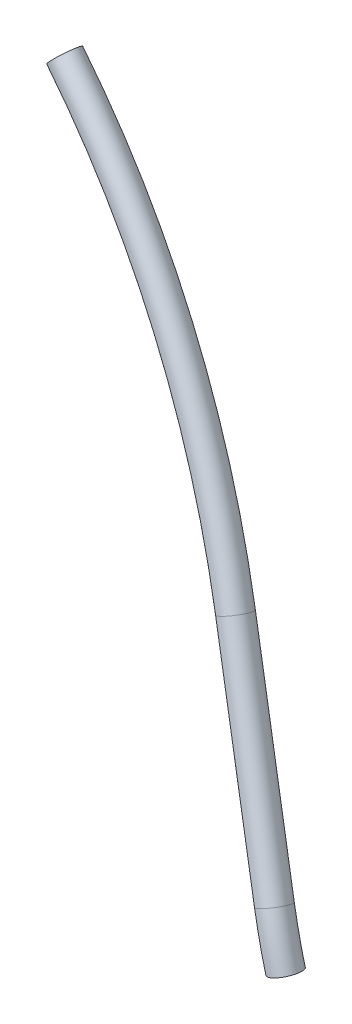
ISO-10303-21;
HEADER;
FILE_DESCRIPTION(('STEP AP214'),'2;1');
FILE_NAME('part.step','',(''),(''),'','','');
FILE_SCHEMA(('AUTOMOTIVE_DESIGN { 1 0 10303 214 1 1 1 1 }'));
ENDSEC;
DATA;
#1=APPLICATION_CONTEXT('core data for automotive mechanical design processes');
#2=APPLICATION_PROTOCOL_DEFINITION('international standard','automotive_design',2000,#1);
#3=PRODUCT_CONTEXT('',#1,'mechanical');
#4=PRODUCT('Part','Part','',(#3));
#5=PRODUCT_RELATED_PRODUCT_CATEGORY('part','',(#4));
#6=PRODUCT_DEFINITION_FORMATION('','',#4);
#7=PRODUCT_DEFINITION_CONTEXT('part definition',#1,'design');
#8=PRODUCT_DEFINITION('design','',#6,#7);
#9=PRODUCT_DEFINITION_SHAPE('','',#8);
#10=(LENGTH_UNIT() NAMED_UNIT(*) SI_UNIT(.MILLI.,.METRE.));
#11=(NAMED_UNIT(*) PLANE_ANGLE_UNIT() SI_UNIT($,.RADIAN.));
#12=(NAMED_UNIT(*) SI_UNIT($,.STERADIAN.) SOLID_ANGLE_UNIT());
#13=UNCERTAINTY_MEASURE_WITH_UNIT(LENGTH_MEASURE(1.E-05),#10,'distance_accuracy_value','');
#14=(GEOMETRIC_REPRESENTATION_CONTEXT(3) GLOBAL_UNCERTAINTY_ASSIGNED_CONTEXT((#13)) GLOBAL_UNIT_ASSIGNED_CONTEXT((#10,
#11,#12)) REPRESENTATION_CONTEXT('',''));
#15=CARTESIAN_POINT('',(0.,0.,0.));
#16=DIRECTION('',(0.,0.,1.));
#17=DIRECTION('',(1.,0.,0.));
#18=AXIS2_PLACEMENT_3D('',#15,#16,#17);
#19=CARTESIAN_POINT('',(6705.32256335604,-309.99440213929,-17391.8785170311));
#20=DIRECTION('',(0.880338086487031,0.32193340687543,-0.34837298261767));
#21=DIRECTION('',(-0.367962451624877,0.,-0.929840649893416));
#22=AXIS2_PLACEMENT_3D('',#19,#20,#21);
#23=TOROIDAL_SURFACE('',#22,1277.2478935044,50.7999999999759);
#24=CARTESIAN_POINT('',(7003.95341624499,130.035003235341,-16230.605113577));
#25=DIRECTION('',(-0.412721024758404,0.881855536842798,-0.228017911274692));
#26=DIRECTION('',(-0.906470201117097,-0.422195690073975,0.00791035837939357));
#27=AXIS2_PLACEMENT_3D('',#24,#25,#26);
#28=CIRCLE('',#27,50.7999999999759);
#29=CARTESIAN_POINT('',(7015.8308657236,147.536299504219,-16184.4177687433));
#30=VERTEX_POINT('',#29);
#31=EDGE_CURVE('E10',#30,#30,#28,.T.);
#32=CARTESIAN_POINT('',(7072.98958400039,-27.5267562632746,-16201.7545014659));
#33=DIRECTION('',(-0.377017474580283,0.920570518156006,-0.102018356010516));
#34=DIRECTION('',(-0.925398771019915,-0.378994874100997,0.));
#35=AXIS2_PLACEMENT_3D('',#32,#33,#34);
#36=CIRCLE('',#35,50.7999999999759);
#37=CARTESIAN_POINT('',(7087.61281003483,-16.2921662643636,-16154.4196807955));
#38=VERTEX_POINT('',#37);
#39=EDGE_CURVE('E45',#38,#38,#36,.T.);
#40=CARTESIAN_POINT('',(6705.32256335604,-309.99440213929,-17391.8785170311));
#41=DIRECTION('',(0.880338086487031,0.32193340687543,-0.34837298261767));
#42=DIRECTION('',(-0.367962451624877,0.,-0.929840649893416));
#43=AXIS2_PLACEMENT_3D('',#40,#41,#42);
#44=CIRCLE('',#43,1328.04789350438);
#45=EDGE_CURVE('',#30,#38,#44,.T.);
#46=ORIENTED_EDGE('',*,*,#31,.F.);
#47=ORIENTED_EDGE('',*,*,#39,.T.);
#48=ORIENTED_EDGE('',*,*,#45,.T.);
#49=ORIENTED_EDGE('',*,*,#45,.F.);
#50=EDGE_LOOP('',(#46,#48,#47,#49));
#51=FACE_BOUND('',#50,.T.);
#52=ADVANCED_FACE('F39',(#51),#23,.T.);
#53=CARTESIAN_POINT('',(7072.98958400039,-27.5267562632746,-16201.7545014659));
#54=DIRECTION('',(-0.377017474580283,0.920570518156006,-0.102018356010516));
#55=DIRECTION('',(-0.925398771019915,-0.378994874100997,0.));
#56=AXIS2_PLACEMENT_3D('',#53,#54,#55);
#57=PLANE('',#56);
#58=ORIENTED_EDGE('',*,*,#39,.F.);
#59=EDGE_LOOP('',(#58));
#60=FACE_BOUND('',#59,.T.);
#61=ADVANCED_FACE('F72',(#60),#57,.F.);
#62=CARTESIAN_POINT('',(3369.476803593,-494.759324471937,-15368.9868803506));
#63=DIRECTION('',(0.16633326668774,0.319091894980362,0.933013186911539));
#64=DIRECTION('',(0.,-0.946194054153527,0.323599771144099));
#65=AXIS2_PLACEMENT_3D('',#62,#63,#64);
#66=TOROIDAL_SURFACE('',#65,3711.57570778875,50.7999999999748);
#67=CARTESIAN_POINT('',(6693.34692567774,793.703769919597,-16402.2073314407));
#68=DIRECTION('',(-0.412721024758404,0.881855536842798,-0.228017911274691));
#69=DIRECTION('',(-0.905714839372379,-0.423887520152064,0.));
#70=AXIS2_PLACEMENT_3D('',#67,#68,#69);
#71=CIRCLE('',#70,50.7999999999748);
#72=CARTESIAN_POINT('',(6738.84043449867,811.338847403724,-16416.3489260215));
#73=VERTEX_POINT('',#72);
#74=EDGE_CURVE('E53',#73,#73,#71,.T.);
#75=CARTESIAN_POINT('',(5835.0026903186,1966.06146880738,-16650.1337727473));
#76=DIRECTION('',(-0.72874219828597,0.677196347478894,-0.101685374555913));
#77=DIRECTION('',(-0.684107065843518,-0.726567457556473,0.0640097811501994));
#78=AXIS2_PLACEMENT_3D('',#75,#76,#77);
#79=CIRCLE('',#78,50.7999999999748);
#80=CARTESIAN_POINT('',(5868.74811945878,1999.74249976041,-16667.6687140384));
#81=VERTEX_POINT('',#80);
#82=EDGE_CURVE('E49',#81,#81,#79,.T.);
#83=CARTESIAN_POINT('',(3369.476803593,-494.759324471937,-15368.9868803506));
#84=DIRECTION('',(0.16633326668774,0.319091894980362,0.933013186911539));
#85=DIRECTION('',(0.,-0.946194054153527,0.323599771144099));
#86=AXIS2_PLACEMENT_3D('',#83,#84,#85);
#87=CIRCLE('',#86,3762.37570778872);
#88=EDGE_CURVE('',#73,#81,#87,.T.);
#89=ORIENTED_EDGE('',*,*,#74,.T.);
#90=ORIENTED_EDGE('',*,*,#82,.F.);
#91=ORIENTED_EDGE('',*,*,#88,.T.);
#92=ORIENTED_EDGE('',*,*,#88,.F.);
#93=EDGE_LOOP('',(#89,#91,#90,#92));
#94=FACE_BOUND('',#93,.T.);
#95=ADVANCED_FACE('F59',(#94),#66,.T.);
#96=CARTESIAN_POINT('',(6693.34692567774,793.703769919597,-16402.2073314407));
#97=DIRECTION('',(0.412721024758405,-0.881855536842796,0.228017911274697));
#98=DIRECTION('',(0.905714839372378,0.423887520152066,0.));
#99=AXIS2_PLACEMENT_3D('',#96,#97,#98);
#100=CYLINDRICAL_SURFACE('',#99,50.7999999999748);
#101=ORIENTED_EDGE('',*,*,#74,.F.);
#102=EDGE_LOOP('',(#101));
#103=FACE_BOUND('',#102,.T.);
#104=ORIENTED_EDGE('',*,*,#31,.T.);
#105=EDGE_LOOP('',(#104));
#106=FACE_BOUND('',#105,.T.);
#107=ADVANCED_FACE('F62',(#103,#106),#100,.T.);
#108=CARTESIAN_POINT('',(5835.0026903186,1966.06146880738,-16650.1337727473));
#109=DIRECTION('',(-0.72874219828597,0.677196347478894,-0.101685374555913));
#110=DIRECTION('',(-0.684107065843518,-0.726567457556473,0.0640097811501994));
#111=AXIS2_PLACEMENT_3D('',#108,#109,#110);
#112=PLANE('',#111);
#113=ORIENTED_EDGE('',*,*,#82,.T.);
#114=EDGE_LOOP('',(#113));
#115=FACE_BOUND('',#114,.T.);
#116=ADVANCED_FACE('F64',(#115),#112,.T.);
#117=CLOSED_SHELL('',(#52,#61,#95,#107,#116));
#118=MANIFOLD_SOLID_BREP('B2',#117);
#119=ADVANCED_BREP_SHAPE_REPRESENTATION('',(#18,#118),#14);
#120=SHAPE_DEFINITION_REPRESENTATION(#9,#119);
ENDSEC;
END-ISO-10303-21;
